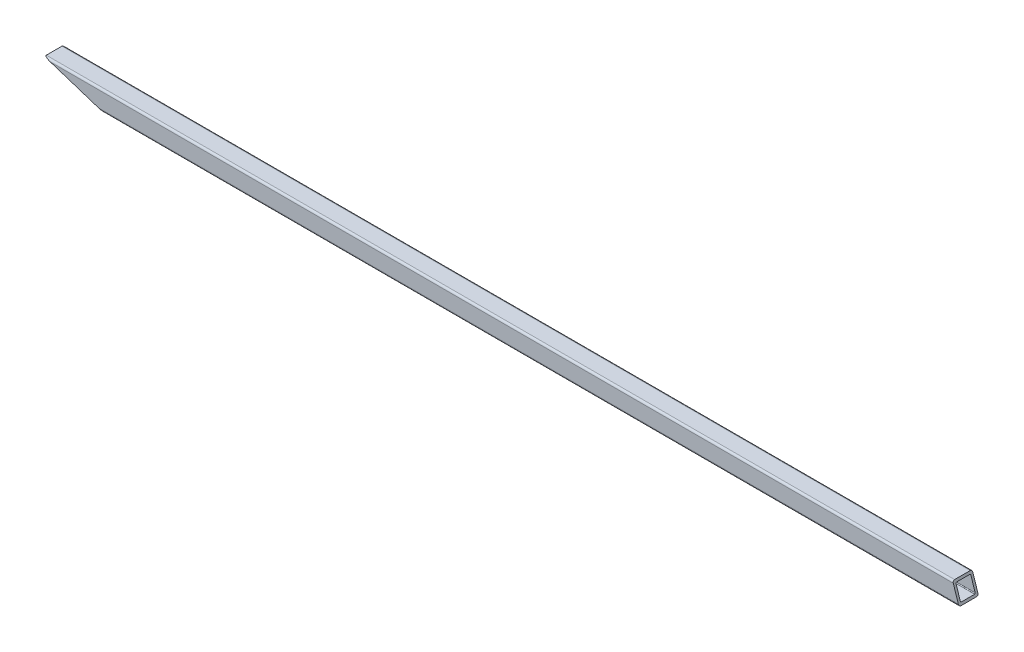
ISO-10303-21;
HEADER;
FILE_DESCRIPTION(('STEP AP214'),'2;1');
FILE_NAME('part.step','',(''),(''),'','','');
FILE_SCHEMA(('AUTOMOTIVE_DESIGN { 1 0 10303 214 1 1 1 1 }'));
ENDSEC;
DATA;
#1=APPLICATION_CONTEXT('core data for automotive mechanical design processes');
#2=APPLICATION_PROTOCOL_DEFINITION('international standard','automotive_design',2000,#1);
#3=PRODUCT_CONTEXT('',#1,'mechanical');
#4=PRODUCT('Part','Part','',(#3));
#5=PRODUCT_RELATED_PRODUCT_CATEGORY('part','',(#4));
#6=PRODUCT_DEFINITION_FORMATION('','',#4);
#7=PRODUCT_DEFINITION_CONTEXT('part definition',#1,'design');
#8=PRODUCT_DEFINITION('design','',#6,#7);
#9=PRODUCT_DEFINITION_SHAPE('','',#8);
#10=(LENGTH_UNIT() NAMED_UNIT(*) SI_UNIT(.MILLI.,.METRE.));
#11=(NAMED_UNIT(*) PLANE_ANGLE_UNIT() SI_UNIT($,.RADIAN.));
#12=(NAMED_UNIT(*) SI_UNIT($,.STERADIAN.) SOLID_ANGLE_UNIT());
#13=UNCERTAINTY_MEASURE_WITH_UNIT(LENGTH_MEASURE(1.E-05),#10,'distance_accuracy_value','');
#14=(GEOMETRIC_REPRESENTATION_CONTEXT(3) GLOBAL_UNCERTAINTY_ASSIGNED_CONTEXT((#13)) GLOBAL_UNIT_ASSIGNED_CONTEXT((#10,
#11,#12)) REPRESENTATION_CONTEXT('',''));
#15=CARTESIAN_POINT('',(0.,0.,0.));
#16=DIRECTION('',(0.,0.,1.));
#17=DIRECTION('',(1.,0.,0.));
#18=AXIS2_PLACEMENT_3D('',#15,#16,#17);
#19=CARTESIAN_POINT('',(-1190.03,12.7,-12.7));
#20=DIRECTION('',(0.,0.,-1.));
#21=DIRECTION('',(0.,1.,0.));
#22=AXIS2_PLACEMENT_3D('',#19,#20,#21);
#23=PLANE('',#22);
#24=DIRECTION('',(-0.309016994374941,0.951056516295156,0.));
#25=VECTOR('',#24,1.);
#26=CARTESIAN_POINT('',(-8.25296028431564,12.7,-12.7));
#27=LINE('',#26,#25);
#28=CARTESIAN_POINT('',(-0.812299240582301,-10.2,-12.7));
#29=VERTEX_POINT('',#28);
#30=CARTESIAN_POINT('',(-7.4406610437334,10.2,-12.7));
#31=VERTEX_POINT('',#30);
#32=EDGE_CURVE('E162',#29,#31,#27,.T.);
#33=ORIENTED_EDGE('',*,*,#32,.F.);
#34=DIRECTION('',(1.,0.,0.));
#35=VECTOR('',#34,1.);
#36=CARTESIAN_POINT('',(-1190.03,-10.2,-12.7));
#37=LINE('',#36,#35);
#38=CARTESIAN_POINT('',(-1119.55104699869,-10.2,-12.7));
#39=VERTEX_POINT('',#38);
#40=EDGE_CURVE('E176',#29,#39,#37,.F.);
#41=ORIENTED_EDGE('',*,*,#40,.T.);
#42=DIRECTION('',(0.951056516295155,-0.309016994374944,0.));
#43=VECTOR('',#42,1.);
#44=CARTESIAN_POINT('',(-1190.03,12.7,-12.7));
#45=LINE('',#44,#43);
#46=CARTESIAN_POINT('',(-1182.33579115706,10.2,-12.7));
#47=VERTEX_POINT('',#46);
#48=EDGE_CURVE('E170',#47,#39,#45,.T.);
#49=ORIENTED_EDGE('',*,*,#48,.F.);
#50=DIRECTION('',(1.,0.,0.));
#51=VECTOR('',#50,1.);
#52=CARTESIAN_POINT('',(-1190.03,10.2,-12.7));
#53=LINE('',#52,#51);
#54=EDGE_CURVE('E179',#47,#31,#53,.T.);
#55=ORIENTED_EDGE('',*,*,#54,.T.);
#56=EDGE_LOOP('',(#33,#41,#49,#55));
#57=FACE_BOUND('',#56,.T.);
#58=ADVANCED_FACE('F41',(#57),#23,.T.);
#59=CARTESIAN_POINT('',(-1190.03,-12.7,12.7));
#60=DIRECTION('',(0.,-1.,0.));
#61=DIRECTION('',(0.,0.,-1.));
#62=AXIS2_PLACEMENT_3D('',#59,#60,#61);
#63=PLANE('',#62);
#64=DIRECTION('',(0.,0.,-1.));
#65=VECTOR('',#64,1.);
#66=CARTESIAN_POINT('',(-1111.85683815575,-12.7,12.7));
#67=LINE('',#66,#65);
#68=CARTESIAN_POINT('',(-1111.85683815575,-12.7,10.2));
#69=VERTEX_POINT('',#68);
#70=CARTESIAN_POINT('',(-1111.85683815575,-12.7,-10.2));
#71=VERTEX_POINT('',#70);
#72=EDGE_CURVE('E260',#69,#71,#67,.T.);
#73=ORIENTED_EDGE('',*,*,#72,.T.);
#74=DIRECTION('',(1.,0.,0.));
#75=VECTOR('',#74,1.);
#76=CARTESIAN_POINT('',(-1190.03,-12.7,-10.2));
#77=LINE('',#76,#75);
#78=CARTESIAN_POINT('',(-1.00180280737661E-13,-12.7,-10.2));
#79=VERTEX_POINT('',#78);
#80=EDGE_CURVE('E194',#71,#79,#77,.T.);
#81=ORIENTED_EDGE('',*,*,#80,.T.);
#82=DIRECTION('',(0.,0.,-1.));
#83=VECTOR('',#82,1.);
#84=CARTESIAN_POINT('',(0.,-12.7,12.7));
#85=LINE('',#84,#83);
#86=CARTESIAN_POINT('',(-1.00180280737661E-13,-12.7,10.2));
#87=VERTEX_POINT('',#86);
#88=EDGE_CURVE('E165',#87,#79,#85,.T.);
#89=ORIENTED_EDGE('',*,*,#88,.F.);
#90=DIRECTION('',(1.,0.,0.));
#91=VECTOR('',#90,1.);
#92=CARTESIAN_POINT('',(-1190.03,-12.7,10.2));
#93=LINE('',#92,#91);
#94=EDGE_CURVE('E288',#87,#69,#93,.F.);
#95=ORIENTED_EDGE('',*,*,#94,.T.);
#96=EDGE_LOOP('',(#73,#81,#89,#95));
#97=FACE_BOUND('',#96,.T.);
#98=ADVANCED_FACE('F295',(#97),#63,.T.);
#99=CARTESIAN_POINT('',(-1190.03,12.7,12.7));
#100=DIRECTION('',(0.,0.,1.));
#101=DIRECTION('',(0.,-1.,0.));
#102=AXIS2_PLACEMENT_3D('',#99,#100,#101);
#103=PLANE('',#102);
#104=DIRECTION('',(-0.309016994374941,0.951056516295156,0.));
#105=VECTOR('',#104,1.);
#106=CARTESIAN_POINT('',(-8.25296028431564,12.7,12.7));
#107=LINE('',#106,#105);
#108=CARTESIAN_POINT('',(-0.812299240582301,-10.2,12.7));
#109=VERTEX_POINT('',#108);
#110=CARTESIAN_POINT('',(-7.44066104373341,10.2,12.7));
#111=VERTEX_POINT('',#110);
#112=EDGE_CURVE('E180',#109,#111,#107,.T.);
#113=ORIENTED_EDGE('',*,*,#112,.T.);
#114=DIRECTION('',(1.,0.,0.));
#115=VECTOR('',#114,1.);
#116=CARTESIAN_POINT('',(-1190.03,10.2,12.7));
#117=LINE('',#116,#115);
#118=CARTESIAN_POINT('',(-1182.33579115706,10.2,12.7));
#119=VERTEX_POINT('',#118);
#120=EDGE_CURVE('E186',#111,#119,#117,.F.);
#121=ORIENTED_EDGE('',*,*,#120,.T.);
#122=DIRECTION('',(0.951056516295155,-0.309016994374944,0.));
#123=VECTOR('',#122,1.);
#124=CARTESIAN_POINT('',(-1190.03,12.7,12.7));
#125=LINE('',#124,#123);
#126=CARTESIAN_POINT('',(-1119.55104699869,-10.2,12.7));
#127=VERTEX_POINT('',#126);
#128=EDGE_CURVE('E299',#119,#127,#125,.T.);
#129=ORIENTED_EDGE('',*,*,#128,.T.);
#130=DIRECTION('',(1.,0.,0.));
#131=VECTOR('',#130,1.);
#132=CARTESIAN_POINT('',(-1190.03,-10.2,12.7));
#133=LINE('',#132,#131);
#134=EDGE_CURVE('E191',#127,#109,#133,.T.);
#135=ORIENTED_EDGE('',*,*,#134,.T.);
#136=EDGE_LOOP('',(#113,#121,#129,#135));
#137=FACE_BOUND('',#136,.T.);
#138=ADVANCED_FACE('F333',(#137),#103,.T.);
#139=CARTESIAN_POINT('',(-1190.03,12.7,12.7));
#140=DIRECTION('',(0.,1.,0.));
#141=DIRECTION('',(0.,0.,1.));
#142=AXIS2_PLACEMENT_3D('',#139,#140,#141);
#143=PLANE('',#142);
#144=DIRECTION('',(0.,0.,-1.));
#145=VECTOR('',#144,1.);
#146=CARTESIAN_POINT('',(-8.25296028431564,12.7,12.7));
#147=LINE('',#146,#145);
#148=CARTESIAN_POINT('',(-8.25296028431555,12.7,10.2));
#149=VERTEX_POINT('',#148);
#150=CARTESIAN_POINT('',(-8.25296028431567,12.7,-10.2));
#151=VERTEX_POINT('',#150);
#152=EDGE_CURVE('E56',#149,#151,#147,.T.);
#153=ORIENTED_EDGE('',*,*,#152,.T.);
#154=DIRECTION('',(1.,0.,0.));
#155=VECTOR('',#154,1.);
#156=CARTESIAN_POINT('',(-1190.03,12.7,-10.2));
#157=LINE('',#156,#155);
#158=CARTESIAN_POINT('',(-1190.03,12.7,-10.2));
#159=VERTEX_POINT('',#158);
#160=EDGE_CURVE('E205',#151,#159,#157,.F.);
#161=ORIENTED_EDGE('',*,*,#160,.T.);
#162=DIRECTION('',(0.,0.,1.));
#163=VECTOR('',#162,1.);
#164=CARTESIAN_POINT('',(-1190.03,12.7,12.7));
#165=LINE('',#164,#163);
#166=CARTESIAN_POINT('',(-1190.03,12.7,10.2));
#167=VERTEX_POINT('',#166);
#168=EDGE_CURVE('E285',#159,#167,#165,.T.);
#169=ORIENTED_EDGE('',*,*,#168,.T.);
#170=DIRECTION('',(1.,0.,0.));
#171=VECTOR('',#170,1.);
#172=CARTESIAN_POINT('',(-1190.03,12.7,10.2));
#173=LINE('',#172,#171);
#174=EDGE_CURVE('E201',#167,#149,#173,.T.);
#175=ORIENTED_EDGE('',*,*,#174,.T.);
#176=EDGE_LOOP('',(#153,#161,#169,#175));
#177=FACE_BOUND('',#176,.T.);
#178=ADVANCED_FACE('F344',(#177),#143,.T.);
#179=CARTESIAN_POINT('',(-1190.03,-9.652,-9.652));
#180=DIRECTION('',(0.,0.,-1.));
#181=DIRECTION('',(-1.,0.,0.));
#182=AXIS2_PLACEMENT_3D('',#179,#180,#181);
#183=PLANE('',#182);
#184=DIRECTION('',(1.,0.,0.));
#185=VECTOR('',#184,1.);
#186=CARTESIAN_POINT('',(0.,-8.652,-9.652));
#187=LINE('',#186,#185);
#188=CARTESIAN_POINT('',(-1124.31530111423,-8.652,-9.652));
#189=VERTEX_POINT('',#188);
#190=CARTESIAN_POINT('',(-1.31527493035066,-8.652,-9.652));
#191=VERTEX_POINT('',#190);
#192=EDGE_CURVE('E211',#189,#191,#187,.T.);
#193=ORIENTED_EDGE('',*,*,#192,.T.);
#194=DIRECTION('',(-0.309016994374941,0.951056516295156,0.));
#195=VECTOR('',#194,1.);
#196=CARTESIAN_POINT('',(-114.53353781648,339.797983792227,-9.652));
#197=LINE('',#196,#195);
#198=CARTESIAN_POINT('',(-6.93768535396481,8.65200000000005,-9.652));
#199=VERTEX_POINT('',#198);
#200=EDGE_CURVE('E313',#191,#199,#197,.T.);
#201=ORIENTED_EDGE('',*,*,#200,.T.);
#202=DIRECTION('',(1.,0.,0.));
#203=VECTOR('',#202,1.);
#204=CARTESIAN_POINT('',(-1190.03,8.652,-9.652));
#205=LINE('',#204,#203);
#206=CARTESIAN_POINT('',(-1177.57153704151,8.652,-9.652));
#207=VERTEX_POINT('',#206);
#208=EDGE_CURVE('E208',#199,#207,#205,.F.);
#209=ORIENTED_EDGE('',*,*,#208,.T.);
#210=DIRECTION('',(0.951056516295155,-0.309016994374944,0.));
#211=VECTOR('',#210,1.);
#212=CARTESIAN_POINT('',(-1183.46091202038,10.5655739291345,-9.652));
#213=LINE('',#212,#211);
#214=EDGE_CURVE('E269',#207,#189,#213,.T.);
#215=ORIENTED_EDGE('',*,*,#214,.T.);
#216=EDGE_LOOP('',(#193,#201,#209,#215));
#217=FACE_BOUND('',#216,.T.);
#218=ADVANCED_FACE('F383',(#217),#183,.F.);
#219=CARTESIAN_POINT('',(-1190.03,-9.652,9.652));
#220=DIRECTION('',(0.,-1.,0.));
#221=DIRECTION('',(0.,0.,-1.));
#222=AXIS2_PLACEMENT_3D('',#219,#220,#221);
#223=PLANE('',#222);
#224=DIRECTION('',(1.,0.,0.));
#225=VECTOR('',#224,1.);
#226=CARTESIAN_POINT('',(0.,-9.652,8.652));
#227=LINE('',#226,#225);
#228=CARTESIAN_POINT('',(-1121.23761757706,-9.652,8.652));
#229=VERTEX_POINT('',#228);
#230=CARTESIAN_POINT('',(-0.990355234117763,-9.652,8.652));
#231=VERTEX_POINT('',#230);
#232=EDGE_CURVE('E215',#229,#231,#227,.T.);
#233=ORIENTED_EDGE('',*,*,#232,.T.);
#234=DIRECTION('',(0.,0.,-1.));
#235=VECTOR('',#234,1.);
#236=CARTESIAN_POINT('',(-0.990355234117946,-9.652,9.65200000000005));
#237=LINE('',#236,#235);
#238=CARTESIAN_POINT('',(-0.990355234117945,-9.652,-8.652));
#239=VERTEX_POINT('',#238);
#240=EDGE_CURVE('E64',#231,#239,#237,.T.);
#241=ORIENTED_EDGE('',*,*,#240,.T.);
#242=DIRECTION('',(1.,0.,0.));
#243=VECTOR('',#242,1.);
#244=CARTESIAN_POINT('',(-1190.03,-9.652,-8.652));
#245=LINE('',#244,#243);
#246=CARTESIAN_POINT('',(-1121.23761757706,-9.652,-8.652));
#247=VERTEX_POINT('',#246);
#248=EDGE_CURVE('E219',#239,#247,#245,.F.);
#249=ORIENTED_EDGE('',*,*,#248,.T.);
#250=DIRECTION('',(0.,0.,1.));
#251=VECTOR('',#250,1.);
#252=CARTESIAN_POINT('',(-1121.23761757706,-9.652,9.65200000000003));
#253=LINE('',#252,#251);
#254=EDGE_CURVE('E247',#247,#229,#253,.T.);
#255=ORIENTED_EDGE('',*,*,#254,.T.);
#256=EDGE_LOOP('',(#233,#241,#249,#255));
#257=FACE_BOUND('',#256,.T.);
#258=ADVANCED_FACE('F252',(#257),#223,.F.);
#259=CARTESIAN_POINT('',(-1190.03,-9.652,9.652));
#260=DIRECTION('',(0.,0.,1.));
#261=DIRECTION('',(1.,0.,0.));
#262=AXIS2_PLACEMENT_3D('',#259,#260,#261);
#263=PLANE('',#262);
#264=DIRECTION('',(1.,0.,0.));
#265=VECTOR('',#264,1.);
#266=CARTESIAN_POINT('',(0.,8.652,9.652));
#267=LINE('',#266,#265);
#268=CARTESIAN_POINT('',(-1177.57153704151,8.652,9.652));
#269=VERTEX_POINT('',#268);
#270=CARTESIAN_POINT('',(-6.93768535396481,8.65200000000005,9.652));
#271=VERTEX_POINT('',#270);
#272=EDGE_CURVE('E232',#269,#271,#267,.T.);
#273=ORIENTED_EDGE('',*,*,#272,.T.);
#274=DIRECTION('',(0.309016994374941,-0.951056516295156,0.));
#275=VECTOR('',#274,1.);
#276=CARTESIAN_POINT('',(-114.53353781648,339.797983792227,9.652));
#277=LINE('',#276,#275);
#278=CARTESIAN_POINT('',(-1.31527493035066,-8.652,9.652));
#279=VERTEX_POINT('',#278);
#280=EDGE_CURVE('E326',#271,#279,#277,.T.);
#281=ORIENTED_EDGE('',*,*,#280,.T.);
#282=DIRECTION('',(1.,0.,0.));
#283=VECTOR('',#282,1.);
#284=CARTESIAN_POINT('',(-1190.03,-8.652,9.652));
#285=LINE('',#284,#283);
#286=CARTESIAN_POINT('',(-1124.31530111423,-8.652,9.652));
#287=VERTEX_POINT('',#286);
#288=EDGE_CURVE('E229',#279,#287,#285,.F.);
#289=ORIENTED_EDGE('',*,*,#288,.T.);
#290=DIRECTION('',(-0.951056516295155,0.309016994374944,0.));
#291=VECTOR('',#290,1.);
#292=CARTESIAN_POINT('',(-1183.46091202038,10.5655739291345,9.652));
#293=LINE('',#292,#291);
#294=EDGE_CURVE('E250',#287,#269,#293,.T.);
#295=ORIENTED_EDGE('',*,*,#294,.T.);
#296=EDGE_LOOP('',(#273,#281,#289,#295));
#297=FACE_BOUND('',#296,.T.);
#298=ADVANCED_FACE('F373',(#297),#263,.F.);
#299=CARTESIAN_POINT('',(-1190.03,9.652,9.652));
#300=DIRECTION('',(0.,1.,0.));
#301=DIRECTION('',(0.,0.,1.));
#302=AXIS2_PLACEMENT_3D('',#299,#300,#301);
#303=PLANE('',#302);
#304=DIRECTION('',(1.,0.,0.));
#305=VECTOR('',#304,1.);
#306=CARTESIAN_POINT('',(0.,9.652,-8.652));
#307=LINE('',#306,#305);
#308=CARTESIAN_POINT('',(-1180.64922057869,9.652,-8.652));
#309=VERTEX_POINT('',#308);
#310=CARTESIAN_POINT('',(-7.26260505019782,9.652,-8.652));
#311=VERTEX_POINT('',#310);
#312=EDGE_CURVE('E225',#309,#311,#307,.T.);
#313=ORIENTED_EDGE('',*,*,#312,.T.);
#314=DIRECTION('',(0.,0.,1.));
#315=VECTOR('',#314,1.);
#316=CARTESIAN_POINT('',(-7.26260505019782,9.652,9.65200000000005));
#317=LINE('',#316,#315);
#318=CARTESIAN_POINT('',(-7.2626050501976,9.652,8.652));
#319=VERTEX_POINT('',#318);
#320=EDGE_CURVE('E316',#311,#319,#317,.T.);
#321=ORIENTED_EDGE('',*,*,#320,.T.);
#322=DIRECTION('',(1.,0.,0.));
#323=VECTOR('',#322,1.);
#324=CARTESIAN_POINT('',(-1190.03,9.652,8.652));
#325=LINE('',#324,#323);
#326=CARTESIAN_POINT('',(-1180.64922057869,9.652,8.652));
#327=VERTEX_POINT('',#326);
#328=EDGE_CURVE('E222',#319,#327,#325,.F.);
#329=ORIENTED_EDGE('',*,*,#328,.T.);
#330=DIRECTION('',(0.,0.,-1.));
#331=VECTOR('',#330,1.);
#332=CARTESIAN_POINT('',(-1180.64922057869,9.652,9.652));
#333=LINE('',#332,#331);
#334=EDGE_CURVE('E266',#327,#309,#333,.T.);
#335=ORIENTED_EDGE('',*,*,#334,.T.);
#336=EDGE_LOOP('',(#313,#321,#329,#335));
#337=FACE_BOUND('',#336,.T.);
#338=ADVANCED_FACE('F369',(#337),#303,.F.);
#339=CARTESIAN_POINT('',(-1190.03,-10.2,-10.2));
#340=DIRECTION('',(1.,0.,0.));
#341=DIRECTION('',(0.,0.,-1.));
#342=AXIS2_PLACEMENT_3D('',#339,#340,#341);
#343=CYLINDRICAL_SURFACE('',#342,2.5);
#344=CARTESIAN_POINT('',(-0.812299240582348,-10.2,-10.2));
#345=DIRECTION('',(-0.951056516295156,-0.309016994374941,0.));
#346=DIRECTION('',(0.309016994374941,-0.951056516295156,0.));
#347=AXIS2_PLACEMENT_3D('',#344,#345,#346);
#348=ELLIPSE('',#347,2.62865556059566,2.5);
#349=EDGE_CURVE('E159',#79,#29,#348,.F.);
#350=ORIENTED_EDGE('',*,*,#349,.F.);
#351=ORIENTED_EDGE('',*,*,#80,.F.);
#352=CARTESIAN_POINT('',(-1119.55104699869,-10.2,-10.2));
#353=DIRECTION('',(0.309016994374944,0.951056516295155,0.));
#354=DIRECTION('',(0.951056516295155,-0.309016994374944,0.));
#355=AXIS2_PLACEMENT_3D('',#352,#353,#354);
#356=ELLIPSE('',#355,8.09016994374958,2.5);
#357=EDGE_CURVE('E184',#39,#71,#356,.F.);
#358=ORIENTED_EDGE('',*,*,#357,.F.);
#359=ORIENTED_EDGE('',*,*,#40,.F.);
#360=EDGE_LOOP('',(#350,#351,#358,#359));
#361=FACE_BOUND('',#360,.T.);
#362=ADVANCED_FACE('F183',(#361),#343,.T.);
#363=CARTESIAN_POINT('',(-1190.03,-10.2,10.2));
#364=DIRECTION('',(1.,0.,0.));
#365=DIRECTION('',(0.,0.,-1.));
#366=AXIS2_PLACEMENT_3D('',#363,#364,#365);
#367=CYLINDRICAL_SURFACE('',#366,2.5);
#368=CARTESIAN_POINT('',(-0.812299240582348,-10.2,10.2));
#369=DIRECTION('',(-0.951056516295156,-0.309016994374941,0.));
#370=DIRECTION('',(0.309016994374941,-0.951056516295156,0.));
#371=AXIS2_PLACEMENT_3D('',#368,#369,#370);
#372=ELLIPSE('',#371,2.62865556059566,2.5);
#373=EDGE_CURVE('E171',#109,#87,#372,.F.);
#374=ORIENTED_EDGE('',*,*,#373,.F.);
#375=ORIENTED_EDGE('',*,*,#134,.F.);
#376=CARTESIAN_POINT('',(-1119.55104699869,-10.2,10.2));
#377=DIRECTION('',(0.309016994374944,0.951056516295155,0.));
#378=DIRECTION('',(0.951056516295155,-0.309016994374944,0.));
#379=AXIS2_PLACEMENT_3D('',#376,#377,#378);
#380=ELLIPSE('',#379,8.09016994374958,2.5);
#381=EDGE_CURVE('E280',#69,#127,#380,.F.);
#382=ORIENTED_EDGE('',*,*,#381,.F.);
#383=ORIENTED_EDGE('',*,*,#94,.F.);
#384=EDGE_LOOP('',(#374,#375,#382,#383));
#385=FACE_BOUND('',#384,.T.);
#386=ADVANCED_FACE('F349',(#385),#367,.T.);
#387=CARTESIAN_POINT('',(-1190.03,10.2,-10.2));
#388=DIRECTION('',(1.,0.,0.));
#389=DIRECTION('',(0.,0.,-1.));
#390=AXIS2_PLACEMENT_3D('',#387,#388,#389);
#391=CYLINDRICAL_SURFACE('',#390,2.5);
#392=CARTESIAN_POINT('',(-7.44066104373342,10.2,-10.2));
#393=DIRECTION('',(-0.951056516295156,-0.309016994374941,0.));
#394=DIRECTION('',(0.309016994374941,-0.951056516295156,0.));
#395=AXIS2_PLACEMENT_3D('',#392,#393,#394);
#396=ELLIPSE('',#395,2.62865556059566,2.5);
#397=EDGE_CURVE('E306',#31,#151,#396,.F.);
#398=ORIENTED_EDGE('',*,*,#397,.F.);
#399=ORIENTED_EDGE('',*,*,#54,.F.);
#400=CARTESIAN_POINT('',(-1182.33579115706,10.2,-10.2));
#401=DIRECTION('',(0.309016994374944,0.951056516295155,0.));
#402=DIRECTION('',(0.951056516295155,-0.309016994374944,0.));
#403=AXIS2_PLACEMENT_3D('',#400,#401,#402);
#404=ELLIPSE('',#403,8.09016994374958,2.5);
#405=EDGE_CURVE('E278',#159,#47,#404,.F.);
#406=ORIENTED_EDGE('',*,*,#405,.F.);
#407=ORIENTED_EDGE('',*,*,#160,.F.);
#408=EDGE_LOOP('',(#398,#399,#406,#407));
#409=FACE_BOUND('',#408,.T.);
#410=ADVANCED_FACE('F347',(#409),#391,.T.);
#411=CARTESIAN_POINT('',(-1190.03,10.2,10.2));
#412=DIRECTION('',(1.,0.,0.));
#413=DIRECTION('',(0.,0.,-1.));
#414=AXIS2_PLACEMENT_3D('',#411,#412,#413);
#415=CYLINDRICAL_SURFACE('',#414,2.5);
#416=CARTESIAN_POINT('',(-7.44066104373342,10.2,10.2));
#417=DIRECTION('',(-0.951056516295156,-0.309016994374941,0.));
#418=DIRECTION('',(0.309016994374941,-0.951056516295156,0.));
#419=AXIS2_PLACEMENT_3D('',#416,#417,#418);
#420=ELLIPSE('',#419,2.62865556059566,2.5);
#421=EDGE_CURVE('E308',#149,#111,#420,.F.);
#422=ORIENTED_EDGE('',*,*,#421,.F.);
#423=ORIENTED_EDGE('',*,*,#174,.F.);
#424=CARTESIAN_POINT('',(-1182.33579115706,10.2,10.2));
#425=DIRECTION('',(0.309016994374944,0.951056516295155,0.));
#426=DIRECTION('',(0.951056516295155,-0.309016994374944,0.));
#427=AXIS2_PLACEMENT_3D('',#424,#425,#426);
#428=ELLIPSE('',#427,8.09016994374958,2.5);
#429=EDGE_CURVE('E276',#119,#167,#428,.F.);
#430=ORIENTED_EDGE('',*,*,#429,.F.);
#431=ORIENTED_EDGE('',*,*,#120,.F.);
#432=EDGE_LOOP('',(#422,#423,#430,#431));
#433=FACE_BOUND('',#432,.T.);
#434=ADVANCED_FACE('F339',(#433),#415,.T.);
#435=CARTESIAN_POINT('',(-1190.03,-8.652,-8.652));
#436=DIRECTION('',(-1.,0.,0.));
#437=DIRECTION('',(0.,0.,1.));
#438=AXIS2_PLACEMENT_3D('',#435,#436,#437);
#439=CYLINDRICAL_SURFACE('',#438,1.);
#440=ORIENTED_EDGE('',*,*,#248,.F.);
#441=CARTESIAN_POINT('',(-1.31527493035066,-8.652,-8.652));
#442=DIRECTION('',(-0.951056516295156,-0.309016994374941,0.));
#443=DIRECTION('',(-0.309016994374941,0.951056516295156,0.));
#444=AXIS2_PLACEMENT_3D('',#441,#442,#443);
#445=ELLIPSE('',#444,1.05146222423827,1.);
#446=EDGE_CURVE('E319',#239,#191,#445,.F.);
#447=ORIENTED_EDGE('',*,*,#446,.T.);
#448=ORIENTED_EDGE('',*,*,#192,.F.);
#449=CARTESIAN_POINT('',(-1124.31530111423,-8.652,-8.652));
#450=DIRECTION('',(0.309016994374944,0.951056516295155,0.));
#451=DIRECTION('',(-0.951056516295155,0.309016994374944,0.));
#452=AXIS2_PLACEMENT_3D('',#449,#450,#451);
#453=ELLIPSE('',#452,3.23606797749983,1.);
#454=EDGE_CURVE('E257',#189,#247,#453,.F.);
#455=ORIENTED_EDGE('',*,*,#454,.T.);
#456=EDGE_LOOP('',(#440,#447,#448,#455));
#457=FACE_BOUND('',#456,.T.);
#458=ADVANCED_FACE('F355',(#457),#439,.F.);
#459=CARTESIAN_POINT('',(-1190.03,8.652,-8.652));
#460=DIRECTION('',(-1.,0.,0.));
#461=DIRECTION('',(0.,0.,1.));
#462=AXIS2_PLACEMENT_3D('',#459,#460,#461);
#463=CYLINDRICAL_SURFACE('',#462,1.);
#464=ORIENTED_EDGE('',*,*,#208,.F.);
#465=CARTESIAN_POINT('',(-6.93768535396488,8.652,-8.652));
#466=DIRECTION('',(-0.951056516295156,-0.309016994374941,0.));
#467=DIRECTION('',(-0.309016994374941,0.951056516295156,0.));
#468=AXIS2_PLACEMENT_3D('',#465,#466,#467);
#469=ELLIPSE('',#468,1.05146222423827,1.);
#470=EDGE_CURVE('E310',#199,#311,#469,.F.);
#471=ORIENTED_EDGE('',*,*,#470,.T.);
#472=ORIENTED_EDGE('',*,*,#312,.F.);
#473=CARTESIAN_POINT('',(-1177.57153704151,8.652,-8.652));
#474=DIRECTION('',(0.309016994374944,0.951056516295155,0.));
#475=DIRECTION('',(-0.951056516295155,0.309016994374944,0.));
#476=AXIS2_PLACEMENT_3D('',#473,#474,#475);
#477=ELLIPSE('',#476,3.23606797749983,1.);
#478=EDGE_CURVE('E273',#309,#207,#477,.F.);
#479=ORIENTED_EDGE('',*,*,#478,.T.);
#480=EDGE_LOOP('',(#464,#471,#472,#479));
#481=FACE_BOUND('',#480,.T.);
#482=ADVANCED_FACE('F461',(#481),#463,.F.);
#483=CARTESIAN_POINT('',(-1190.03,8.652,8.652));
#484=DIRECTION('',(-1.,0.,0.));
#485=DIRECTION('',(0.,0.,1.));
#486=AXIS2_PLACEMENT_3D('',#483,#484,#485);
#487=CYLINDRICAL_SURFACE('',#486,1.);
#488=ORIENTED_EDGE('',*,*,#328,.F.);
#489=CARTESIAN_POINT('',(-6.93768535396488,8.652,8.652));
#490=DIRECTION('',(-0.951056516295156,-0.309016994374941,0.));
#491=DIRECTION('',(-0.309016994374941,0.951056516295156,0.));
#492=AXIS2_PLACEMENT_3D('',#489,#490,#491);
#493=ELLIPSE('',#492,1.05146222423827,1.);
#494=EDGE_CURVE('E322',#319,#271,#493,.F.);
#495=ORIENTED_EDGE('',*,*,#494,.T.);
#496=ORIENTED_EDGE('',*,*,#272,.F.);
#497=CARTESIAN_POINT('',(-1177.57153704151,8.652,8.652));
#498=DIRECTION('',(0.309016994374944,0.951056516295155,0.));
#499=DIRECTION('',(-0.951056516295155,0.309016994374944,0.));
#500=AXIS2_PLACEMENT_3D('',#497,#498,#499);
#501=ELLIPSE('',#500,3.23606797749983,1.);
#502=EDGE_CURVE('E254',#269,#327,#501,.F.);
#503=ORIENTED_EDGE('',*,*,#502,.T.);
#504=EDGE_LOOP('',(#488,#495,#496,#503));
#505=FACE_BOUND('',#504,.T.);
#506=ADVANCED_FACE('F470',(#505),#487,.F.);
#507=CARTESIAN_POINT('',(-1190.03,-8.652,8.652));
#508=DIRECTION('',(-1.,0.,0.));
#509=DIRECTION('',(0.,0.,1.));
#510=AXIS2_PLACEMENT_3D('',#507,#508,#509);
#511=CYLINDRICAL_SURFACE('',#510,1.);
#512=ORIENTED_EDGE('',*,*,#288,.F.);
#513=CARTESIAN_POINT('',(-1.31527493035066,-8.652,8.652));
#514=DIRECTION('',(-0.951056516295156,-0.309016994374941,0.));
#515=DIRECTION('',(-0.309016994374941,0.951056516295156,0.));
#516=AXIS2_PLACEMENT_3D('',#513,#514,#515);
#517=ELLIPSE('',#516,1.05146222423827,1.);
#518=EDGE_CURVE('E11',#279,#231,#517,.F.);
#519=ORIENTED_EDGE('',*,*,#518,.T.);
#520=ORIENTED_EDGE('',*,*,#232,.F.);
#521=CARTESIAN_POINT('',(-1124.31530111423,-8.652,8.652));
#522=DIRECTION('',(0.309016994374944,0.951056516295155,0.));
#523=DIRECTION('',(-0.951056516295155,0.309016994374944,0.));
#524=AXIS2_PLACEMENT_3D('',#521,#522,#523);
#525=ELLIPSE('',#524,3.23606797749983,1.);
#526=EDGE_CURVE('E49',#229,#287,#525,.F.);
#527=ORIENTED_EDGE('',*,*,#526,.T.);
#528=EDGE_LOOP('',(#512,#519,#520,#527));
#529=FACE_BOUND('',#528,.T.);
#530=ADVANCED_FACE('F43',(#529),#511,.F.);
#531=CARTESIAN_POINT('',(-1190.03,12.7,12.7));
#532=DIRECTION('',(0.309016994374944,0.951056516295155,0.));
#533=DIRECTION('',(-0.951056516295155,0.309016994374944,0.));
#534=AXIS2_PLACEMENT_3D('',#531,#532,#533);
#535=PLANE('',#534);
#536=ORIENTED_EDGE('',*,*,#357,.T.);
#537=ORIENTED_EDGE('',*,*,#72,.F.);
#538=ORIENTED_EDGE('',*,*,#381,.T.);
#539=ORIENTED_EDGE('',*,*,#128,.F.);
#540=ORIENTED_EDGE('',*,*,#429,.T.);
#541=ORIENTED_EDGE('',*,*,#168,.F.);
#542=ORIENTED_EDGE('',*,*,#405,.T.);
#543=ORIENTED_EDGE('',*,*,#48,.T.);
#544=EDGE_LOOP('',(#536,#537,#538,#539,#540,#541,#542,#543));
#545=FACE_BOUND('',#544,.T.);
#546=ORIENTED_EDGE('',*,*,#334,.F.);
#547=ORIENTED_EDGE('',*,*,#502,.F.);
#548=ORIENTED_EDGE('',*,*,#294,.F.);
#549=ORIENTED_EDGE('',*,*,#526,.F.);
#550=ORIENTED_EDGE('',*,*,#254,.F.);
#551=ORIENTED_EDGE('',*,*,#454,.F.);
#552=ORIENTED_EDGE('',*,*,#214,.F.);
#553=ORIENTED_EDGE('',*,*,#478,.F.);
#554=EDGE_LOOP('',(#546,#547,#548,#549,#550,#551,#552,#553));
#555=FACE_BOUND('',#554,.T.);
#556=ADVANCED_FACE('F246',(#545,#555),#535,.F.);
#557=CARTESIAN_POINT('',(-8.25296028431564,12.7,12.7));
#558=DIRECTION('',(-0.951056516295156,-0.309016994374941,0.));
#559=DIRECTION('',(0.309016994374941,-0.951056516295156,0.));
#560=AXIS2_PLACEMENT_3D('',#557,#558,#559);
#561=PLANE('',#560);
#562=ORIENTED_EDGE('',*,*,#349,.T.);
#563=ORIENTED_EDGE('',*,*,#32,.T.);
#564=ORIENTED_EDGE('',*,*,#397,.T.);
#565=ORIENTED_EDGE('',*,*,#152,.F.);
#566=ORIENTED_EDGE('',*,*,#421,.T.);
#567=ORIENTED_EDGE('',*,*,#112,.F.);
#568=ORIENTED_EDGE('',*,*,#373,.T.);
#569=ORIENTED_EDGE('',*,*,#88,.T.);
#570=EDGE_LOOP('',(#562,#563,#564,#565,#566,#567,#568,#569));
#571=FACE_BOUND('',#570,.T.);
#572=ORIENTED_EDGE('',*,*,#200,.F.);
#573=ORIENTED_EDGE('',*,*,#446,.F.);
#574=ORIENTED_EDGE('',*,*,#240,.F.);
#575=ORIENTED_EDGE('',*,*,#518,.F.);
#576=ORIENTED_EDGE('',*,*,#280,.F.);
#577=ORIENTED_EDGE('',*,*,#494,.F.);
#578=ORIENTED_EDGE('',*,*,#320,.F.);
#579=ORIENTED_EDGE('',*,*,#470,.F.);
#580=EDGE_LOOP('',(#572,#573,#574,#575,#576,#577,#578,#579));
#581=FACE_BOUND('',#580,.T.);
#582=ADVANCED_FACE('F161',(#571,#581),#561,.F.);
#583=CLOSED_SHELL('',(#58,#98,#138,#178,#218,#258,#298,#338,#362,#386,#410,#434,#458,#482,#506,
#530,#556,#582));
#584=MANIFOLD_SOLID_BREP('B2',#583);
#585=ADVANCED_BREP_SHAPE_REPRESENTATION('',(#18,#584),#14);
#586=SHAPE_DEFINITION_REPRESENTATION(#9,#585);
ENDSEC;
END-ISO-10303-21;
